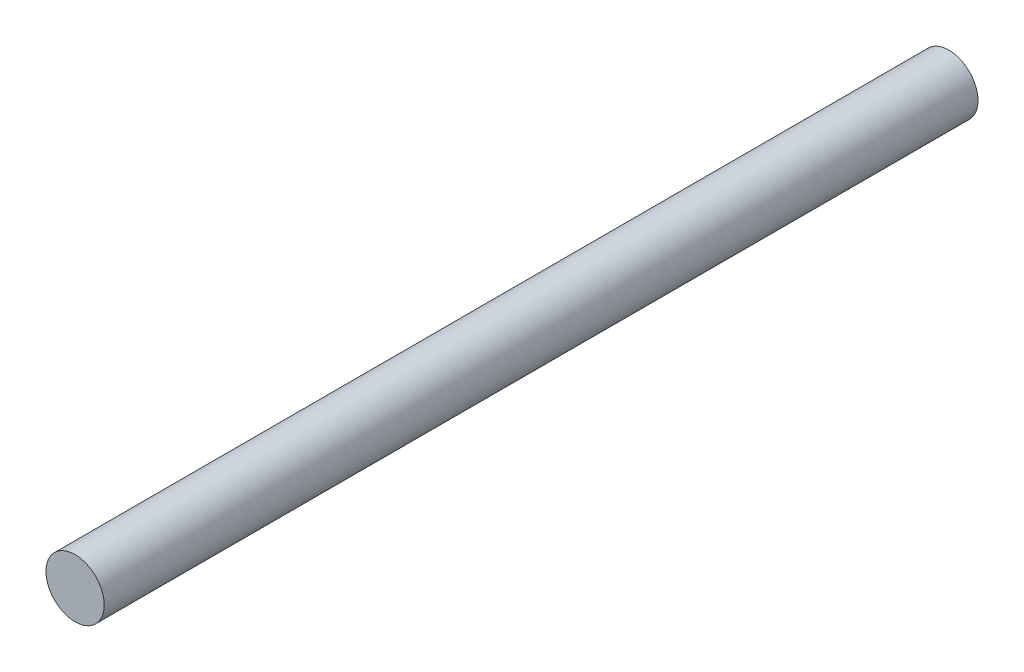
ISO-10303-21;
HEADER;
FILE_DESCRIPTION(('STEP AP214'),'2;1');
FILE_NAME('part.step','',(''),(''),'','','');
FILE_SCHEMA(('AUTOMOTIVE_DESIGN { 1 0 10303 214 1 1 1 1 }'));
ENDSEC;
DATA;
#1=APPLICATION_CONTEXT('core data for automotive mechanical design processes');
#2=APPLICATION_PROTOCOL_DEFINITION('international standard','automotive_design',2000,#1);
#3=PRODUCT_CONTEXT('',#1,'mechanical');
#4=PRODUCT('Part','Part','',(#3));
#5=PRODUCT_RELATED_PRODUCT_CATEGORY('part','',(#4));
#6=PRODUCT_DEFINITION_FORMATION('','',#4);
#7=PRODUCT_DEFINITION_CONTEXT('part definition',#1,'design');
#8=PRODUCT_DEFINITION('design','',#6,#7);
#9=PRODUCT_DEFINITION_SHAPE('','',#8);
#10=(LENGTH_UNIT() NAMED_UNIT(*) SI_UNIT(.MILLI.,.METRE.));
#11=(NAMED_UNIT(*) PLANE_ANGLE_UNIT() SI_UNIT($,.RADIAN.));
#12=(NAMED_UNIT(*) SI_UNIT($,.STERADIAN.) SOLID_ANGLE_UNIT());
#13=UNCERTAINTY_MEASURE_WITH_UNIT(LENGTH_MEASURE(1.E-05),#10,'distance_accuracy_value','');
#14=(GEOMETRIC_REPRESENTATION_CONTEXT(3) GLOBAL_UNCERTAINTY_ASSIGNED_CONTEXT((#13)) GLOBAL_UNIT_ASSIGNED_CONTEXT((#10,
#11,#12)) REPRESENTATION_CONTEXT('',''));
#15=CARTESIAN_POINT('',(0.,0.,0.));
#16=DIRECTION('',(0.,0.,1.));
#17=DIRECTION('',(1.,0.,0.));
#18=AXIS2_PLACEMENT_3D('',#15,#16,#17);
#19=CARTESIAN_POINT('',(0.,0.,150.));
#20=DIRECTION('',(0.,0.,-1.));
#21=DIRECTION('',(-1.,0.,0.));
#22=AXIS2_PLACEMENT_3D('',#19,#20,#21);
#23=CYLINDRICAL_SURFACE('',#22,5.);
#24=CARTESIAN_POINT('',(0.,0.,150.));
#25=DIRECTION('',(0.,0.,1.));
#26=DIRECTION('',(1.,0.,0.));
#27=AXIS2_PLACEMENT_3D('',#24,#25,#26);
#28=CIRCLE('',#27,5.);
#29=CARTESIAN_POINT('',(5.,0.,150.));
#30=VERTEX_POINT('',#29);
#31=EDGE_CURVE('E10',#30,#30,#28,.T.);
#32=ORIENTED_EDGE('',*,*,#31,.F.);
#33=EDGE_LOOP('',(#32));
#34=FACE_BOUND('',#33,.T.);
#35=CARTESIAN_POINT('',(0.,0.,0.));
#36=DIRECTION('',(0.,0.,1.));
#37=DIRECTION('',(1.,0.,0.));
#38=AXIS2_PLACEMENT_3D('',#35,#36,#37);
#39=CIRCLE('',#38,5.);
#40=CARTESIAN_POINT('',(5.,0.,0.));
#41=VERTEX_POINT('',#40);
#42=EDGE_CURVE('E39',#41,#41,#39,.T.);
#43=ORIENTED_EDGE('',*,*,#42,.T.);
#44=EDGE_LOOP('',(#43));
#45=FACE_BOUND('',#44,.T.);
#46=ADVANCED_FACE('F36',(#34,#45),#23,.T.);
#47=CARTESIAN_POINT('',(0.,0.,150.));
#48=DIRECTION('',(0.,0.,1.));
#49=DIRECTION('',(1.,0.,0.));
#50=AXIS2_PLACEMENT_3D('',#47,#48,#49);
#51=PLANE('',#50);
#52=ORIENTED_EDGE('',*,*,#31,.T.);
#53=EDGE_LOOP('',(#52));
#54=FACE_BOUND('',#53,.T.);
#55=ADVANCED_FACE('F51',(#54),#51,.T.);
#56=CARTESIAN_POINT('',(0.,0.,0.));
#57=DIRECTION('',(0.,0.,1.));
#58=DIRECTION('',(1.,0.,0.));
#59=AXIS2_PLACEMENT_3D('',#56,#57,#58);
#60=PLANE('',#59);
#61=ORIENTED_EDGE('',*,*,#42,.F.);
#62=EDGE_LOOP('',(#61));
#63=FACE_BOUND('',#62,.T.);
#64=ADVANCED_FACE('F49',(#63),#60,.F.);
#65=CLOSED_SHELL('',(#46,#55,#64));
#66=MANIFOLD_SOLID_BREP('B2',#65);
#67=ADVANCED_BREP_SHAPE_REPRESENTATION('',(#18,#66),#14);
#68=SHAPE_DEFINITION_REPRESENTATION(#9,#67);
ENDSEC;
END-ISO-10303-21;
